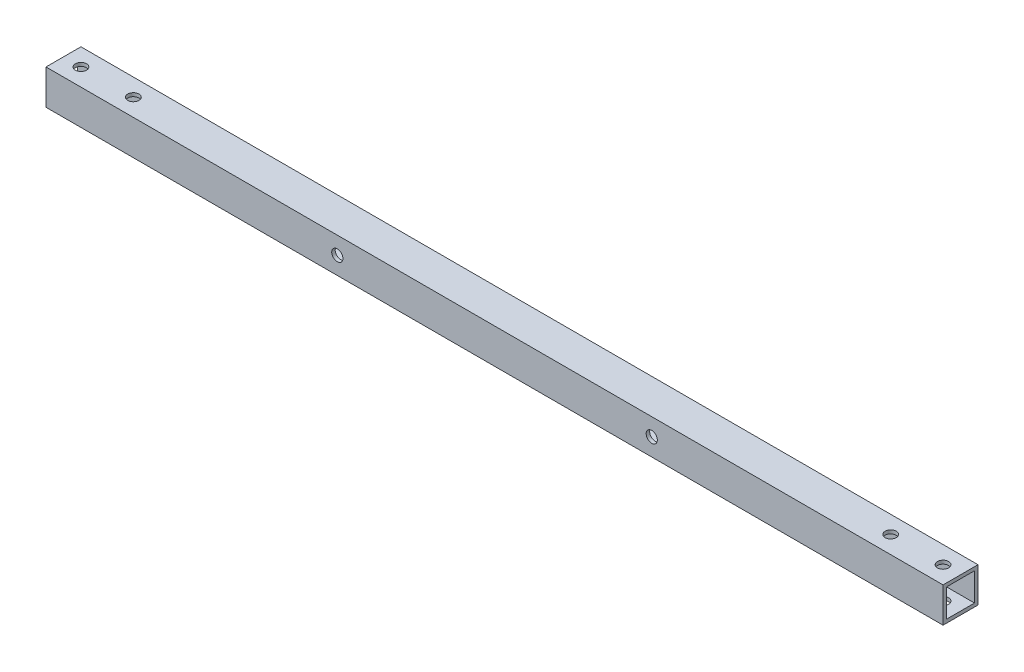
ISO-10303-21;
HEADER;
FILE_DESCRIPTION(('STEP AP214'),'2;1');
FILE_NAME('part.step','',(''),(''),'','','');
FILE_SCHEMA(('AUTOMOTIVE_DESIGN { 1 0 10303 214 1 1 1 1 }'));
ENDSEC;
DATA;
#1=APPLICATION_CONTEXT('core data for automotive mechanical design processes');
#2=APPLICATION_PROTOCOL_DEFINITION('international standard','automotive_design',2000,#1);
#3=PRODUCT_CONTEXT('',#1,'mechanical');
#4=PRODUCT('Part','Part','',(#3));
#5=PRODUCT_RELATED_PRODUCT_CATEGORY('part','',(#4));
#6=PRODUCT_DEFINITION_FORMATION('','',#4);
#7=PRODUCT_DEFINITION_CONTEXT('part definition',#1,'design');
#8=PRODUCT_DEFINITION('design','',#6,#7);
#9=PRODUCT_DEFINITION_SHAPE('','',#8);
#10=(LENGTH_UNIT() NAMED_UNIT(*) SI_UNIT(.MILLI.,.METRE.));
#11=(NAMED_UNIT(*) PLANE_ANGLE_UNIT() SI_UNIT($,.RADIAN.));
#12=(NAMED_UNIT(*) SI_UNIT($,.STERADIAN.) SOLID_ANGLE_UNIT());
#13=UNCERTAINTY_MEASURE_WITH_UNIT(LENGTH_MEASURE(1.E-05),#10,'distance_accuracy_value','');
#14=(GEOMETRIC_REPRESENTATION_CONTEXT(3) GLOBAL_UNCERTAINTY_ASSIGNED_CONTEXT((#13)) GLOBAL_UNIT_ASSIGNED_CONTEXT((#10,
#11,#12)) REPRESENTATION_CONTEXT('',''));
#15=CARTESIAN_POINT('',(0.,0.,0.));
#16=DIRECTION('',(0.,0.,1.));
#17=DIRECTION('',(1.,0.,0.));
#18=AXIS2_PLACEMENT_3D('',#15,#16,#17);
#19=CARTESIAN_POINT('',(128.363049395,5.,-5.));
#20=DIRECTION('',(0.,0.,1.));
#21=DIRECTION('',(1.,0.,0.));
#22=AXIS2_PLACEMENT_3D('',#19,#20,#21);
#23=PLANE('',#22);
#24=CARTESIAN_POINT('',(-45.,0.,-5.));
#25=DIRECTION('',(0.,0.,1.));
#26=DIRECTION('',(1.,0.,0.));
#27=AXIS2_PLACEMENT_3D('',#24,#25,#26);
#28=CIRCLE('',#27,1.60000000000001);
#29=CARTESIAN_POINT('',(-43.4,0.,-5.));
#30=VERTEX_POINT('',#29);
#31=EDGE_CURVE('E185',#30,#30,#28,.T.);
#32=ORIENTED_EDGE('',*,*,#31,.T.);
#33=EDGE_LOOP('',(#32));
#34=FACE_BOUND('',#33,.T.);
#35=CARTESIAN_POINT('',(45.,0.,-5.));
#36=DIRECTION('',(0.,0.,1.));
#37=DIRECTION('',(-1.,0.,0.));
#38=AXIS2_PLACEMENT_3D('',#35,#36,#37);
#39=CIRCLE('',#38,1.60000000000001);
#40=CARTESIAN_POINT('',(43.4,0.,-5.));
#41=VERTEX_POINT('',#40);
#42=EDGE_CURVE('E196',#41,#41,#39,.T.);
#43=ORIENTED_EDGE('',*,*,#42,.T.);
#44=EDGE_LOOP('',(#43));
#45=FACE_BOUND('',#44,.T.);
#46=DIRECTION('',(0.,1.,0.));
#47=VECTOR('',#46,1.);
#48=CARTESIAN_POINT('',(-128.363049395,5.,-5.));
#49=LINE('',#48,#47);
#50=CARTESIAN_POINT('',(-128.363049395,-5.,-5.));
#51=VERTEX_POINT('',#50);
#52=CARTESIAN_POINT('',(-128.363049395,5.,-5.));
#53=VERTEX_POINT('',#52);
#54=EDGE_CURVE('E138',#51,#53,#49,.T.);
#55=ORIENTED_EDGE('',*,*,#54,.T.);
#56=DIRECTION('',(-1.,0.,0.));
#57=VECTOR('',#56,1.);
#58=CARTESIAN_POINT('',(128.363049395,5.,-5.));
#59=LINE('',#58,#57);
#60=CARTESIAN_POINT('',(128.363049395,5.,-5.));
#61=VERTEX_POINT('',#60);
#62=EDGE_CURVE('E11',#61,#53,#59,.T.);
#63=ORIENTED_EDGE('',*,*,#62,.F.);
#64=DIRECTION('',(0.,1.,0.));
#65=VECTOR('',#64,1.);
#66=CARTESIAN_POINT('',(128.363049395,5.,-5.));
#67=LINE('',#66,#65);
#68=CARTESIAN_POINT('',(128.363049395,-5.,-5.));
#69=VERTEX_POINT('',#68);
#70=EDGE_CURVE('E142',#69,#61,#67,.T.);
#71=ORIENTED_EDGE('',*,*,#70,.F.);
#72=DIRECTION('',(-1.,0.,0.));
#73=VECTOR('',#72,1.);
#74=CARTESIAN_POINT('',(128.363049395,-5.,-5.));
#75=LINE('',#74,#73);
#76=EDGE_CURVE('E152',#69,#51,#75,.T.);
#77=ORIENTED_EDGE('',*,*,#76,.T.);
#78=EDGE_LOOP('',(#55,#63,#71,#77));
#79=FACE_BOUND('',#78,.T.);
#80=ADVANCED_FACE('F36',(#34,#45,#79),#23,.F.);
#81=CARTESIAN_POINT('',(128.363049395,5.,5.));
#82=DIRECTION('',(0.,-1.,0.));
#83=DIRECTION('',(0.,0.,-1.));
#84=AXIS2_PLACEMENT_3D('',#81,#82,#83);
#85=PLANE('',#84);
#86=CARTESIAN_POINT('',(-123.363049395,5.,0.));
#87=DIRECTION('',(0.,1.,0.));
#88=DIRECTION('',(0.,0.,1.));
#89=AXIS2_PLACEMENT_3D('',#86,#87,#88);
#90=CIRCLE('',#89,1.60000000000001);
#91=CARTESIAN_POINT('',(-123.363049395,5.,1.60000000000001));
#92=VERTEX_POINT('',#91);
#93=EDGE_CURVE('E210',#92,#92,#90,.T.);
#94=ORIENTED_EDGE('',*,*,#93,.F.);
#95=EDGE_LOOP('',(#94));
#96=FACE_BOUND('',#95,.T.);
#97=CARTESIAN_POINT('',(-108.363049395,5.,0.));
#98=DIRECTION('',(0.,1.,0.));
#99=DIRECTION('',(0.,0.,1.));
#100=AXIS2_PLACEMENT_3D('',#97,#98,#99);
#101=CIRCLE('',#100,1.60000000000001);
#102=CARTESIAN_POINT('',(-108.363049395,5.,1.60000000000001));
#103=VERTEX_POINT('',#102);
#104=EDGE_CURVE('E216',#103,#103,#101,.T.);
#105=ORIENTED_EDGE('',*,*,#104,.F.);
#106=EDGE_LOOP('',(#105));
#107=FACE_BOUND('',#106,.T.);
#108=CARTESIAN_POINT('',(108.363049395,5.,0.));
#109=DIRECTION('',(0.,1.,0.));
#110=DIRECTION('',(0.,0.,-1.));
#111=AXIS2_PLACEMENT_3D('',#108,#109,#110);
#112=CIRCLE('',#111,1.60000000000001);
#113=CARTESIAN_POINT('',(108.363049395,5.,-1.60000000000001));
#114=VERTEX_POINT('',#113);
#115=EDGE_CURVE('E222',#114,#114,#112,.T.);
#116=ORIENTED_EDGE('',*,*,#115,.F.);
#117=EDGE_LOOP('',(#116));
#118=FACE_BOUND('',#117,.T.);
#119=CARTESIAN_POINT('',(123.363049395,5.,0.));
#120=DIRECTION('',(0.,1.,0.));
#121=DIRECTION('',(0.,0.,-1.));
#122=AXIS2_PLACEMENT_3D('',#119,#120,#121);
#123=CIRCLE('',#122,1.60000000000001);
#124=CARTESIAN_POINT('',(123.363049395,5.,-1.60000000000001));
#125=VERTEX_POINT('',#124);
#126=EDGE_CURVE('E207',#125,#125,#123,.T.);
#127=ORIENTED_EDGE('',*,*,#126,.F.);
#128=EDGE_LOOP('',(#127));
#129=FACE_BOUND('',#128,.T.);
#130=DIRECTION('',(0.,0.,1.));
#131=VECTOR('',#130,1.);
#132=CARTESIAN_POINT('',(-128.363049395,5.,5.));
#133=LINE('',#132,#131);
#134=CARTESIAN_POINT('',(-128.363049395,5.,5.));
#135=VERTEX_POINT('',#134);
#136=EDGE_CURVE('E155',#53,#135,#133,.T.);
#137=ORIENTED_EDGE('',*,*,#136,.T.);
#138=DIRECTION('',(-1.,0.,0.));
#139=VECTOR('',#138,1.);
#140=CARTESIAN_POINT('',(128.363049395,5.,5.));
#141=LINE('',#140,#139);
#142=CARTESIAN_POINT('',(128.363049395,5.,5.));
#143=VERTEX_POINT('',#142);
#144=EDGE_CURVE('E44',#143,#135,#141,.T.);
#145=ORIENTED_EDGE('',*,*,#144,.F.);
#146=DIRECTION('',(0.,0.,1.));
#147=VECTOR('',#146,1.);
#148=CARTESIAN_POINT('',(128.363049395,5.,5.));
#149=LINE('',#148,#147);
#150=EDGE_CURVE('E145',#61,#143,#149,.T.);
#151=ORIENTED_EDGE('',*,*,#150,.F.);
#152=ORIENTED_EDGE('',*,*,#62,.T.);
#153=EDGE_LOOP('',(#137,#145,#151,#152));
#154=FACE_BOUND('',#153,.T.);
#155=ADVANCED_FACE('F262',(#96,#107,#118,#129,#154),#85,.F.);
#156=CARTESIAN_POINT('',(128.363049395,5.,5.));
#157=DIRECTION('',(0.,0.,-1.));
#158=DIRECTION('',(0.,1.,0.));
#159=AXIS2_PLACEMENT_3D('',#156,#157,#158);
#160=PLANE('',#159);
#161=CARTESIAN_POINT('',(-45.,0.,5.));
#162=DIRECTION('',(0.,0.,1.));
#163=DIRECTION('',(1.,0.,0.));
#164=AXIS2_PLACEMENT_3D('',#161,#162,#163);
#165=CIRCLE('',#164,1.60000000000001);
#166=CARTESIAN_POINT('',(-43.4,0.,5.));
#167=VERTEX_POINT('',#166);
#168=EDGE_CURVE('E191',#167,#167,#165,.T.);
#169=ORIENTED_EDGE('',*,*,#168,.F.);
#170=EDGE_LOOP('',(#169));
#171=FACE_BOUND('',#170,.T.);
#172=CARTESIAN_POINT('',(45.,0.,5.));
#173=DIRECTION('',(0.,0.,1.));
#174=DIRECTION('',(-1.,0.,0.));
#175=AXIS2_PLACEMENT_3D('',#172,#173,#174);
#176=CIRCLE('',#175,1.60000000000001);
#177=CARTESIAN_POINT('',(43.4,0.,5.));
#178=VERTEX_POINT('',#177);
#179=EDGE_CURVE('E201',#178,#178,#176,.T.);
#180=ORIENTED_EDGE('',*,*,#179,.F.);
#181=EDGE_LOOP('',(#180));
#182=FACE_BOUND('',#181,.T.);
#183=DIRECTION('',(0.,-1.,0.));
#184=VECTOR('',#183,1.);
#185=CARTESIAN_POINT('',(-128.363049395,5.,5.));
#186=LINE('',#185,#184);
#187=CARTESIAN_POINT('',(-128.363049395,-5.,5.));
#188=VERTEX_POINT('',#187);
#189=EDGE_CURVE('E157',#135,#188,#186,.T.);
#190=ORIENTED_EDGE('',*,*,#189,.T.);
#191=DIRECTION('',(-1.,0.,0.));
#192=VECTOR('',#191,1.);
#193=CARTESIAN_POINT('',(128.363049395,-5.,5.));
#194=LINE('',#193,#192);
#195=CARTESIAN_POINT('',(128.363049395,-5.,5.));
#196=VERTEX_POINT('',#195);
#197=EDGE_CURVE('E162',#196,#188,#194,.T.);
#198=ORIENTED_EDGE('',*,*,#197,.F.);
#199=DIRECTION('',(0.,-1.,0.));
#200=VECTOR('',#199,1.);
#201=CARTESIAN_POINT('',(128.363049395,5.,5.));
#202=LINE('',#201,#200);
#203=EDGE_CURVE('E148',#143,#196,#202,.T.);
#204=ORIENTED_EDGE('',*,*,#203,.F.);
#205=ORIENTED_EDGE('',*,*,#144,.T.);
#206=EDGE_LOOP('',(#190,#198,#204,#205));
#207=FACE_BOUND('',#206,.T.);
#208=ADVANCED_FACE('F266',(#171,#182,#207),#160,.F.);
#209=CARTESIAN_POINT('',(128.363049395,-5.,5.));
#210=DIRECTION('',(0.,1.,0.));
#211=DIRECTION('',(0.,0.,1.));
#212=AXIS2_PLACEMENT_3D('',#209,#210,#211);
#213=PLANE('',#212);
#214=CARTESIAN_POINT('',(-123.363049395,-5.,0.));
#215=DIRECTION('',(0.,1.,0.));
#216=DIRECTION('',(0.,0.,1.));
#217=AXIS2_PLACEMENT_3D('',#214,#215,#216);
#218=CIRCLE('',#217,1.60000000000001);
#219=CARTESIAN_POINT('',(-123.363049395,-5.,1.60000000000001));
#220=VERTEX_POINT('',#219);
#221=EDGE_CURVE('E171',#220,#220,#218,.T.);
#222=ORIENTED_EDGE('',*,*,#221,.T.);
#223=EDGE_LOOP('',(#222));
#224=FACE_BOUND('',#223,.T.);
#225=CARTESIAN_POINT('',(-108.363049395,-5.,0.));
#226=DIRECTION('',(0.,1.,0.));
#227=DIRECTION('',(0.,0.,1.));
#228=AXIS2_PLACEMENT_3D('',#225,#226,#227);
#229=CIRCLE('',#228,1.60000000000001);
#230=CARTESIAN_POINT('',(-108.363049395,-5.,1.60000000000001));
#231=VERTEX_POINT('',#230);
#232=EDGE_CURVE('E213',#231,#231,#229,.T.);
#233=ORIENTED_EDGE('',*,*,#232,.T.);
#234=EDGE_LOOP('',(#233));
#235=FACE_BOUND('',#234,.T.);
#236=CARTESIAN_POINT('',(108.363049395,-5.,0.));
#237=DIRECTION('',(0.,1.,0.));
#238=DIRECTION('',(0.,0.,-1.));
#239=AXIS2_PLACEMENT_3D('',#236,#237,#238);
#240=CIRCLE('',#239,1.60000000000001);
#241=CARTESIAN_POINT('',(108.363049395,-5.,-1.60000000000001));
#242=VERTEX_POINT('',#241);
#243=EDGE_CURVE('E219',#242,#242,#240,.T.);
#244=ORIENTED_EDGE('',*,*,#243,.T.);
#245=EDGE_LOOP('',(#244));
#246=FACE_BOUND('',#245,.T.);
#247=CARTESIAN_POINT('',(123.363049395,-5.,0.));
#248=DIRECTION('',(0.,1.,0.));
#249=DIRECTION('',(0.,0.,-1.));
#250=AXIS2_PLACEMENT_3D('',#247,#248,#249);
#251=CIRCLE('',#250,1.60000000000001);
#252=CARTESIAN_POINT('',(123.363049395,-5.,-1.60000000000001));
#253=VERTEX_POINT('',#252);
#254=EDGE_CURVE('E225',#253,#253,#251,.T.);
#255=ORIENTED_EDGE('',*,*,#254,.T.);
#256=EDGE_LOOP('',(#255));
#257=FACE_BOUND('',#256,.T.);
#258=DIRECTION('',(0.,0.,-1.));
#259=VECTOR('',#258,1.);
#260=CARTESIAN_POINT('',(-128.363049395,-5.,5.));
#261=LINE('',#260,#259);
#262=EDGE_CURVE('E146',#188,#51,#261,.T.);
#263=ORIENTED_EDGE('',*,*,#262,.T.);
#264=ORIENTED_EDGE('',*,*,#76,.F.);
#265=DIRECTION('',(0.,0.,-1.));
#266=VECTOR('',#265,1.);
#267=CARTESIAN_POINT('',(128.363049395,-5.,5.));
#268=LINE('',#267,#266);
#269=EDGE_CURVE('E150',#196,#69,#268,.T.);
#270=ORIENTED_EDGE('',*,*,#269,.F.);
#271=ORIENTED_EDGE('',*,*,#197,.T.);
#272=EDGE_LOOP('',(#263,#264,#270,#271));
#273=FACE_BOUND('',#272,.T.);
#274=ADVANCED_FACE('F285',(#224,#235,#246,#257,#273),#213,.F.);
#275=CARTESIAN_POINT('',(128.363049395,0.,0.));
#276=DIRECTION('',(1.,0.,0.));
#277=DIRECTION('',(0.,0.,-1.));
#278=AXIS2_PLACEMENT_3D('',#275,#276,#277);
#279=PLANE('',#278);
#280=DIRECTION('',(0.,1.,0.));
#281=VECTOR('',#280,1.);
#282=CARTESIAN_POINT('',(128.363049395,4.,-4.));
#283=LINE('',#282,#281);
#284=CARTESIAN_POINT('',(128.363049395,-4.,-4.));
#285=VERTEX_POINT('',#284);
#286=CARTESIAN_POINT('',(128.363049395,4.,-4.));
#287=VERTEX_POINT('',#286);
#288=EDGE_CURVE('E52',#285,#287,#283,.T.);
#289=ORIENTED_EDGE('',*,*,#288,.F.);
#290=DIRECTION('',(0.,0.,-1.));
#291=VECTOR('',#290,1.);
#292=CARTESIAN_POINT('',(128.363049395,-4.,4.));
#293=LINE('',#292,#291);
#294=CARTESIAN_POINT('',(128.363049395,-4.,4.));
#295=VERTEX_POINT('',#294);
#296=EDGE_CURVE('E120',#295,#285,#293,.T.);
#297=ORIENTED_EDGE('',*,*,#296,.F.);
#298=DIRECTION('',(0.,-1.,0.));
#299=VECTOR('',#298,1.);
#300=CARTESIAN_POINT('',(128.363049395,4.,4.));
#301=LINE('',#300,#299);
#302=CARTESIAN_POINT('',(128.363049395,4.,4.));
#303=VERTEX_POINT('',#302);
#304=EDGE_CURVE('E123',#303,#295,#301,.T.);
#305=ORIENTED_EDGE('',*,*,#304,.F.);
#306=DIRECTION('',(0.,0.,1.));
#307=VECTOR('',#306,1.);
#308=CARTESIAN_POINT('',(128.363049395,4.,4.));
#309=LINE('',#308,#307);
#310=EDGE_CURVE('E132',#287,#303,#309,.T.);
#311=ORIENTED_EDGE('',*,*,#310,.F.);
#312=EDGE_LOOP('',(#289,#297,#305,#311));
#313=FACE_BOUND('',#312,.T.);
#314=ORIENTED_EDGE('',*,*,#70,.T.);
#315=ORIENTED_EDGE('',*,*,#150,.T.);
#316=ORIENTED_EDGE('',*,*,#203,.T.);
#317=ORIENTED_EDGE('',*,*,#269,.T.);
#318=EDGE_LOOP('',(#314,#315,#316,#317));
#319=FACE_BOUND('',#318,.T.);
#320=ADVANCED_FACE('F281',(#313,#319),#279,.T.);
#321=CARTESIAN_POINT('',(-128.363049395,0.,0.));
#322=DIRECTION('',(1.,0.,0.));
#323=DIRECTION('',(0.,0.,-1.));
#324=AXIS2_PLACEMENT_3D('',#321,#322,#323);
#325=PLANE('',#324);
#326=DIRECTION('',(0.,0.,-1.));
#327=VECTOR('',#326,1.);
#328=CARTESIAN_POINT('',(-128.363049395,-4.,4.));
#329=LINE('',#328,#327);
#330=CARTESIAN_POINT('',(-128.363049395,-4.,4.));
#331=VERTEX_POINT('',#330);
#332=CARTESIAN_POINT('',(-128.363049395,-4.,-4.));
#333=VERTEX_POINT('',#332);
#334=EDGE_CURVE('E110',#331,#333,#329,.T.);
#335=ORIENTED_EDGE('',*,*,#334,.T.);
#336=DIRECTION('',(0.,1.,0.));
#337=VECTOR('',#336,1.);
#338=CARTESIAN_POINT('',(-128.363049395,4.,-4.));
#339=LINE('',#338,#337);
#340=CARTESIAN_POINT('',(-128.363049395,4.,-4.));
#341=VERTEX_POINT('',#340);
#342=EDGE_CURVE('E104',#333,#341,#339,.T.);
#343=ORIENTED_EDGE('',*,*,#342,.T.);
#344=DIRECTION('',(0.,0.,1.));
#345=VECTOR('',#344,1.);
#346=CARTESIAN_POINT('',(-128.363049395,4.,4.));
#347=LINE('',#346,#345);
#348=CARTESIAN_POINT('',(-128.363049395,4.,4.));
#349=VERTEX_POINT('',#348);
#350=EDGE_CURVE('E113',#341,#349,#347,.T.);
#351=ORIENTED_EDGE('',*,*,#350,.T.);
#352=DIRECTION('',(0.,-1.,0.));
#353=VECTOR('',#352,1.);
#354=CARTESIAN_POINT('',(-128.363049395,4.,4.));
#355=LINE('',#354,#353);
#356=EDGE_CURVE('E60',#349,#331,#355,.T.);
#357=ORIENTED_EDGE('',*,*,#356,.T.);
#358=EDGE_LOOP('',(#335,#343,#351,#357));
#359=FACE_BOUND('',#358,.T.);
#360=ORIENTED_EDGE('',*,*,#54,.F.);
#361=ORIENTED_EDGE('',*,*,#262,.F.);
#362=ORIENTED_EDGE('',*,*,#189,.F.);
#363=ORIENTED_EDGE('',*,*,#136,.F.);
#364=EDGE_LOOP('',(#360,#361,#362,#363));
#365=FACE_BOUND('',#364,.T.);
#366=ADVANCED_FACE('F117',(#359,#365),#325,.F.);
#367=CARTESIAN_POINT('',(-128.363049395,4.,-4.));
#368=DIRECTION('',(0.,0.,-1.));
#369=DIRECTION('',(-1.,0.,0.));
#370=AXIS2_PLACEMENT_3D('',#367,#368,#369);
#371=PLANE('',#370);
#372=CARTESIAN_POINT('',(-45.,0.,-4.));
#373=DIRECTION('',(0.,0.,-1.));
#374=DIRECTION('',(-1.,0.,0.));
#375=AXIS2_PLACEMENT_3D('',#372,#373,#374);
#376=CIRCLE('',#375,1.60000000000001);
#377=CARTESIAN_POINT('',(-46.6,0.,-4.));
#378=VERTEX_POINT('',#377);
#379=EDGE_CURVE('E204',#378,#378,#376,.T.);
#380=ORIENTED_EDGE('',*,*,#379,.T.);
#381=EDGE_LOOP('',(#380));
#382=FACE_BOUND('',#381,.T.);
#383=CARTESIAN_POINT('',(45.,0.,-4.));
#384=DIRECTION('',(0.,0.,-1.));
#385=DIRECTION('',(-1.,0.,0.));
#386=AXIS2_PLACEMENT_3D('',#383,#384,#385);
#387=CIRCLE('',#386,1.60000000000001);
#388=CARTESIAN_POINT('',(43.4,0.,-4.));
#389=VERTEX_POINT('',#388);
#390=EDGE_CURVE('E184',#389,#389,#387,.T.);
#391=ORIENTED_EDGE('',*,*,#390,.T.);
#392=EDGE_LOOP('',(#391));
#393=FACE_BOUND('',#392,.T.);
#394=ORIENTED_EDGE('',*,*,#288,.T.);
#395=DIRECTION('',(1.,0.,0.));
#396=VECTOR('',#395,1.);
#397=CARTESIAN_POINT('',(-128.363049395,4.,-4.));
#398=LINE('',#397,#396);
#399=EDGE_CURVE('E100',#341,#287,#398,.T.);
#400=ORIENTED_EDGE('',*,*,#399,.F.);
#401=ORIENTED_EDGE('',*,*,#342,.F.);
#402=DIRECTION('',(1.,0.,0.));
#403=VECTOR('',#402,1.);
#404=CARTESIAN_POINT('',(-128.363049395,-4.,-4.));
#405=LINE('',#404,#403);
#406=EDGE_CURVE('E136',#333,#285,#405,.T.);
#407=ORIENTED_EDGE('',*,*,#406,.T.);
#408=EDGE_LOOP('',(#394,#400,#401,#407));
#409=FACE_BOUND('',#408,.T.);
#410=ADVANCED_FACE('F102',(#382,#393,#409),#371,.F.);
#411=CARTESIAN_POINT('',(-128.363049395,-4.,4.));
#412=DIRECTION('',(0.,-1.,0.));
#413=DIRECTION('',(0.,0.,-1.));
#414=AXIS2_PLACEMENT_3D('',#411,#412,#413);
#415=PLANE('',#414);
#416=CARTESIAN_POINT('',(-123.363049395,-4.,0.));
#417=DIRECTION('',(0.,-1.,0.));
#418=DIRECTION('',(0.,0.,-1.));
#419=AXIS2_PLACEMENT_3D('',#416,#417,#418);
#420=CIRCLE('',#419,1.60000000000001);
#421=CARTESIAN_POINT('',(-123.363049395,-4.,-1.60000000000001));
#422=VERTEX_POINT('',#421);
#423=EDGE_CURVE('E126',#422,#422,#420,.T.);
#424=ORIENTED_EDGE('',*,*,#423,.T.);
#425=EDGE_LOOP('',(#424));
#426=FACE_BOUND('',#425,.T.);
#427=CARTESIAN_POINT('',(-108.363049395,-4.,0.));
#428=DIRECTION('',(0.,-1.,0.));
#429=DIRECTION('',(0.,0.,-1.));
#430=AXIS2_PLACEMENT_3D('',#427,#428,#429);
#431=CIRCLE('',#430,1.60000000000001);
#432=CARTESIAN_POINT('',(-108.363049395,-4.,-1.60000000000001));
#433=VERTEX_POINT('',#432);
#434=EDGE_CURVE('E179',#433,#433,#431,.T.);
#435=ORIENTED_EDGE('',*,*,#434,.T.);
#436=EDGE_LOOP('',(#435));
#437=FACE_BOUND('',#436,.T.);
#438=CARTESIAN_POINT('',(108.363049395,-4.,0.));
#439=DIRECTION('',(0.,-1.,0.));
#440=DIRECTION('',(0.,0.,-1.));
#441=AXIS2_PLACEMENT_3D('',#438,#439,#440);
#442=CIRCLE('',#441,1.60000000000001);
#443=CARTESIAN_POINT('',(108.363049395,-4.,-1.60000000000001));
#444=VERTEX_POINT('',#443);
#445=EDGE_CURVE('E175',#444,#444,#442,.T.);
#446=ORIENTED_EDGE('',*,*,#445,.T.);
#447=EDGE_LOOP('',(#446));
#448=FACE_BOUND('',#447,.T.);
#449=CARTESIAN_POINT('',(123.363049395,-4.,0.));
#450=DIRECTION('',(0.,-1.,0.));
#451=DIRECTION('',(0.,0.,-1.));
#452=AXIS2_PLACEMENT_3D('',#449,#450,#451);
#453=CIRCLE('',#452,1.60000000000001);
#454=CARTESIAN_POINT('',(123.363049395,-4.,-1.60000000000001));
#455=VERTEX_POINT('',#454);
#456=EDGE_CURVE('E170',#455,#455,#453,.T.);
#457=ORIENTED_EDGE('',*,*,#456,.T.);
#458=EDGE_LOOP('',(#457));
#459=FACE_BOUND('',#458,.T.);
#460=ORIENTED_EDGE('',*,*,#296,.T.);
#461=ORIENTED_EDGE('',*,*,#406,.F.);
#462=ORIENTED_EDGE('',*,*,#334,.F.);
#463=DIRECTION('',(1.,0.,0.));
#464=VECTOR('',#463,1.);
#465=CARTESIAN_POINT('',(-128.363049395,-4.,4.));
#466=LINE('',#465,#464);
#467=EDGE_CURVE('E139',#331,#295,#466,.T.);
#468=ORIENTED_EDGE('',*,*,#467,.T.);
#469=EDGE_LOOP('',(#460,#461,#462,#468));
#470=FACE_BOUND('',#469,.T.);
#471=ADVANCED_FACE('F236',(#426,#437,#448,#459,#470),#415,.F.);
#472=CARTESIAN_POINT('',(-128.363049395,4.,4.));
#473=DIRECTION('',(0.,0.,1.));
#474=DIRECTION('',(1.,0.,0.));
#475=AXIS2_PLACEMENT_3D('',#472,#473,#474);
#476=PLANE('',#475);
#477=CARTESIAN_POINT('',(-45.,0.,4.));
#478=DIRECTION('',(0.,0.,1.));
#479=DIRECTION('',(1.,0.,0.));
#480=AXIS2_PLACEMENT_3D('',#477,#478,#479);
#481=CIRCLE('',#480,1.60000000000001);
#482=CARTESIAN_POINT('',(-43.4,0.,4.));
#483=VERTEX_POINT('',#482);
#484=EDGE_CURVE('E39',#483,#483,#481,.T.);
#485=ORIENTED_EDGE('',*,*,#484,.T.);
#486=EDGE_LOOP('',(#485));
#487=FACE_BOUND('',#486,.T.);
#488=CARTESIAN_POINT('',(45.,0.,4.));
#489=DIRECTION('',(0.,0.,1.));
#490=DIRECTION('',(1.,0.,0.));
#491=AXIS2_PLACEMENT_3D('',#488,#489,#490);
#492=CIRCLE('',#491,1.60000000000001);
#493=CARTESIAN_POINT('',(46.6,0.,4.));
#494=VERTEX_POINT('',#493);
#495=EDGE_CURVE('E182',#494,#494,#492,.T.);
#496=ORIENTED_EDGE('',*,*,#495,.T.);
#497=EDGE_LOOP('',(#496));
#498=FACE_BOUND('',#497,.T.);
#499=ORIENTED_EDGE('',*,*,#304,.T.);
#500=ORIENTED_EDGE('',*,*,#467,.F.);
#501=ORIENTED_EDGE('',*,*,#356,.F.);
#502=DIRECTION('',(1.,0.,0.));
#503=VECTOR('',#502,1.);
#504=CARTESIAN_POINT('',(-128.363049395,4.,4.));
#505=LINE('',#504,#503);
#506=EDGE_CURVE('E109',#349,#303,#505,.T.);
#507=ORIENTED_EDGE('',*,*,#506,.T.);
#508=EDGE_LOOP('',(#499,#500,#501,#507));
#509=FACE_BOUND('',#508,.T.);
#510=ADVANCED_FACE('F309',(#487,#498,#509),#476,.F.);
#511=CARTESIAN_POINT('',(-128.363049395,4.,4.));
#512=DIRECTION('',(0.,1.,0.));
#513=DIRECTION('',(0.,0.,1.));
#514=AXIS2_PLACEMENT_3D('',#511,#512,#513);
#515=PLANE('',#514);
#516=CARTESIAN_POINT('',(-123.363049395,4.,0.));
#517=DIRECTION('',(0.,1.,0.));
#518=DIRECTION('',(0.,0.,1.));
#519=AXIS2_PLACEMENT_3D('',#516,#517,#518);
#520=CIRCLE('',#519,1.60000000000001);
#521=CARTESIAN_POINT('',(-123.363049395,4.,1.60000000000001));
#522=VERTEX_POINT('',#521);
#523=EDGE_CURVE('E180',#522,#522,#520,.T.);
#524=ORIENTED_EDGE('',*,*,#523,.T.);
#525=EDGE_LOOP('',(#524));
#526=FACE_BOUND('',#525,.T.);
#527=CARTESIAN_POINT('',(-108.363049395,4.,0.));
#528=DIRECTION('',(0.,1.,0.));
#529=DIRECTION('',(0.,0.,1.));
#530=AXIS2_PLACEMENT_3D('',#527,#528,#529);
#531=CIRCLE('',#530,1.60000000000001);
#532=CARTESIAN_POINT('',(-108.363049395,4.,1.60000000000001));
#533=VERTEX_POINT('',#532);
#534=EDGE_CURVE('E176',#533,#533,#531,.T.);
#535=ORIENTED_EDGE('',*,*,#534,.T.);
#536=EDGE_LOOP('',(#535));
#537=FACE_BOUND('',#536,.T.);
#538=CARTESIAN_POINT('',(108.363049395,4.,0.));
#539=DIRECTION('',(0.,1.,0.));
#540=DIRECTION('',(0.,0.,1.));
#541=AXIS2_PLACEMENT_3D('',#538,#539,#540);
#542=CIRCLE('',#541,1.60000000000001);
#543=CARTESIAN_POINT('',(108.363049395,4.,1.60000000000001));
#544=VERTEX_POINT('',#543);
#545=EDGE_CURVE('E172',#544,#544,#542,.T.);
#546=ORIENTED_EDGE('',*,*,#545,.T.);
#547=EDGE_LOOP('',(#546));
#548=FACE_BOUND('',#547,.T.);
#549=CARTESIAN_POINT('',(123.363049395,4.,0.));
#550=DIRECTION('',(0.,1.,0.));
#551=DIRECTION('',(0.,0.,1.));
#552=AXIS2_PLACEMENT_3D('',#549,#550,#551);
#553=CIRCLE('',#552,1.60000000000001);
#554=CARTESIAN_POINT('',(123.363049395,4.,1.60000000000001));
#555=VERTEX_POINT('',#554);
#556=EDGE_CURVE('E167',#555,#555,#553,.T.);
#557=ORIENTED_EDGE('',*,*,#556,.T.);
#558=EDGE_LOOP('',(#557));
#559=FACE_BOUND('',#558,.T.);
#560=ORIENTED_EDGE('',*,*,#310,.T.);
#561=ORIENTED_EDGE('',*,*,#506,.F.);
#562=ORIENTED_EDGE('',*,*,#350,.F.);
#563=ORIENTED_EDGE('',*,*,#399,.T.);
#564=EDGE_LOOP('',(#560,#561,#562,#563));
#565=FACE_BOUND('',#564,.T.);
#566=ADVANCED_FACE('F114',(#526,#537,#548,#559,#565),#515,.F.);
#567=CARTESIAN_POINT('',(123.363049395,-5.,0.));
#568=DIRECTION('',(0.,1.,0.));
#569=DIRECTION('',(0.,0.,1.));
#570=AXIS2_PLACEMENT_3D('',#567,#568,#569);
#571=CYLINDRICAL_SURFACE('',#570,1.60000000000001);
#572=ORIENTED_EDGE('',*,*,#126,.T.);
#573=EDGE_LOOP('',(#572));
#574=FACE_BOUND('',#573,.T.);
#575=ORIENTED_EDGE('',*,*,#556,.F.);
#576=EDGE_LOOP('',(#575));
#577=FACE_BOUND('',#576,.T.);
#578=ADVANCED_FACE('F308',(#574,#577),#571,.F.);
#579=CARTESIAN_POINT('',(108.363049395,-5.,0.));
#580=DIRECTION('',(0.,1.,0.));
#581=DIRECTION('',(0.,0.,1.));
#582=AXIS2_PLACEMENT_3D('',#579,#580,#581);
#583=CYLINDRICAL_SURFACE('',#582,1.60000000000001);
#584=ORIENTED_EDGE('',*,*,#115,.T.);
#585=EDGE_LOOP('',(#584));
#586=FACE_BOUND('',#585,.T.);
#587=ORIENTED_EDGE('',*,*,#545,.F.);
#588=EDGE_LOOP('',(#587));
#589=FACE_BOUND('',#588,.T.);
#590=ADVANCED_FACE('F257',(#586,#589),#583,.F.);
#591=CARTESIAN_POINT('',(-108.363049395,-5.,0.));
#592=DIRECTION('',(0.,1.,0.));
#593=DIRECTION('',(0.,0.,1.));
#594=AXIS2_PLACEMENT_3D('',#591,#592,#593);
#595=CYLINDRICAL_SURFACE('',#594,1.60000000000001);
#596=ORIENTED_EDGE('',*,*,#104,.T.);
#597=EDGE_LOOP('',(#596));
#598=FACE_BOUND('',#597,.T.);
#599=ORIENTED_EDGE('',*,*,#534,.F.);
#600=EDGE_LOOP('',(#599));
#601=FACE_BOUND('',#600,.T.);
#602=ADVANCED_FACE('F245',(#598,#601),#595,.F.);
#603=CARTESIAN_POINT('',(-123.363049395,-5.,0.));
#604=DIRECTION('',(0.,1.,0.));
#605=DIRECTION('',(0.,0.,1.));
#606=AXIS2_PLACEMENT_3D('',#603,#604,#605);
#607=CYLINDRICAL_SURFACE('',#606,1.60000000000001);
#608=ORIENTED_EDGE('',*,*,#93,.T.);
#609=EDGE_LOOP('',(#608));
#610=FACE_BOUND('',#609,.T.);
#611=ORIENTED_EDGE('',*,*,#523,.F.);
#612=EDGE_LOOP('',(#611));
#613=FACE_BOUND('',#612,.T.);
#614=ADVANCED_FACE('F253',(#610,#613),#607,.F.);
#615=ORIENTED_EDGE('',*,*,#254,.F.);
#616=EDGE_LOOP('',(#615));
#617=FACE_BOUND('',#616,.T.);
#618=ORIENTED_EDGE('',*,*,#456,.F.);
#619=EDGE_LOOP('',(#618));
#620=FACE_BOUND('',#619,.T.);
#621=ADVANCED_FACE('F254',(#617,#620),#571,.F.);
#622=ORIENTED_EDGE('',*,*,#243,.F.);
#623=EDGE_LOOP('',(#622));
#624=FACE_BOUND('',#623,.T.);
#625=ORIENTED_EDGE('',*,*,#445,.F.);
#626=EDGE_LOOP('',(#625));
#627=FACE_BOUND('',#626,.T.);
#628=ADVANCED_FACE('F242',(#624,#627),#583,.F.);
#629=ORIENTED_EDGE('',*,*,#232,.F.);
#630=EDGE_LOOP('',(#629));
#631=FACE_BOUND('',#630,.T.);
#632=ORIENTED_EDGE('',*,*,#434,.F.);
#633=EDGE_LOOP('',(#632));
#634=FACE_BOUND('',#633,.T.);
#635=ADVANCED_FACE('F239',(#631,#634),#595,.F.);
#636=ORIENTED_EDGE('',*,*,#221,.F.);
#637=EDGE_LOOP('',(#636));
#638=FACE_BOUND('',#637,.T.);
#639=ORIENTED_EDGE('',*,*,#423,.F.);
#640=EDGE_LOOP('',(#639));
#641=FACE_BOUND('',#640,.T.);
#642=ADVANCED_FACE('F241',(#638,#641),#607,.F.);
#643=CARTESIAN_POINT('',(45.,0.,-5.));
#644=DIRECTION('',(0.,0.,1.));
#645=DIRECTION('',(1.,0.,0.));
#646=AXIS2_PLACEMENT_3D('',#643,#644,#645);
#647=CYLINDRICAL_SURFACE('',#646,1.60000000000001);
#648=ORIENTED_EDGE('',*,*,#179,.T.);
#649=EDGE_LOOP('',(#648));
#650=FACE_BOUND('',#649,.T.);
#651=ORIENTED_EDGE('',*,*,#495,.F.);
#652=EDGE_LOOP('',(#651));
#653=FACE_BOUND('',#652,.T.);
#654=ADVANCED_FACE('F250',(#650,#653),#647,.F.);
#655=CARTESIAN_POINT('',(-45.,0.,-5.));
#656=DIRECTION('',(0.,0.,1.));
#657=DIRECTION('',(1.,0.,0.));
#658=AXIS2_PLACEMENT_3D('',#655,#656,#657);
#659=CYLINDRICAL_SURFACE('',#658,1.60000000000001);
#660=ORIENTED_EDGE('',*,*,#168,.T.);
#661=EDGE_LOOP('',(#660));
#662=FACE_BOUND('',#661,.T.);
#663=ORIENTED_EDGE('',*,*,#484,.F.);
#664=EDGE_LOOP('',(#663));
#665=FACE_BOUND('',#664,.T.);
#666=ADVANCED_FACE('F405',(#662,#665),#659,.F.);
#667=ORIENTED_EDGE('',*,*,#42,.F.);
#668=EDGE_LOOP('',(#667));
#669=FACE_BOUND('',#668,.T.);
#670=ORIENTED_EDGE('',*,*,#390,.F.);
#671=EDGE_LOOP('',(#670));
#672=FACE_BOUND('',#671,.T.);
#673=ADVANCED_FACE('F408',(#669,#672),#647,.F.);
#674=ORIENTED_EDGE('',*,*,#31,.F.);
#675=EDGE_LOOP('',(#674));
#676=FACE_BOUND('',#675,.T.);
#677=ORIENTED_EDGE('',*,*,#379,.F.);
#678=EDGE_LOOP('',(#677));
#679=FACE_BOUND('',#678,.T.);
#680=ADVANCED_FACE('F418',(#676,#679),#659,.F.);
#681=CLOSED_SHELL('',(#80,#155,#208,#274,#320,#366,#410,#471,#510,#566,#578,#590,#602,#614,#621,
#628,#635,#642,#654,#666,#673,#680));
#682=MANIFOLD_SOLID_BREP('B2',#681);
#683=ADVANCED_BREP_SHAPE_REPRESENTATION('',(#18,#682),#14);
#684=SHAPE_DEFINITION_REPRESENTATION(#9,#683);
ENDSEC;
END-ISO-10303-21;
